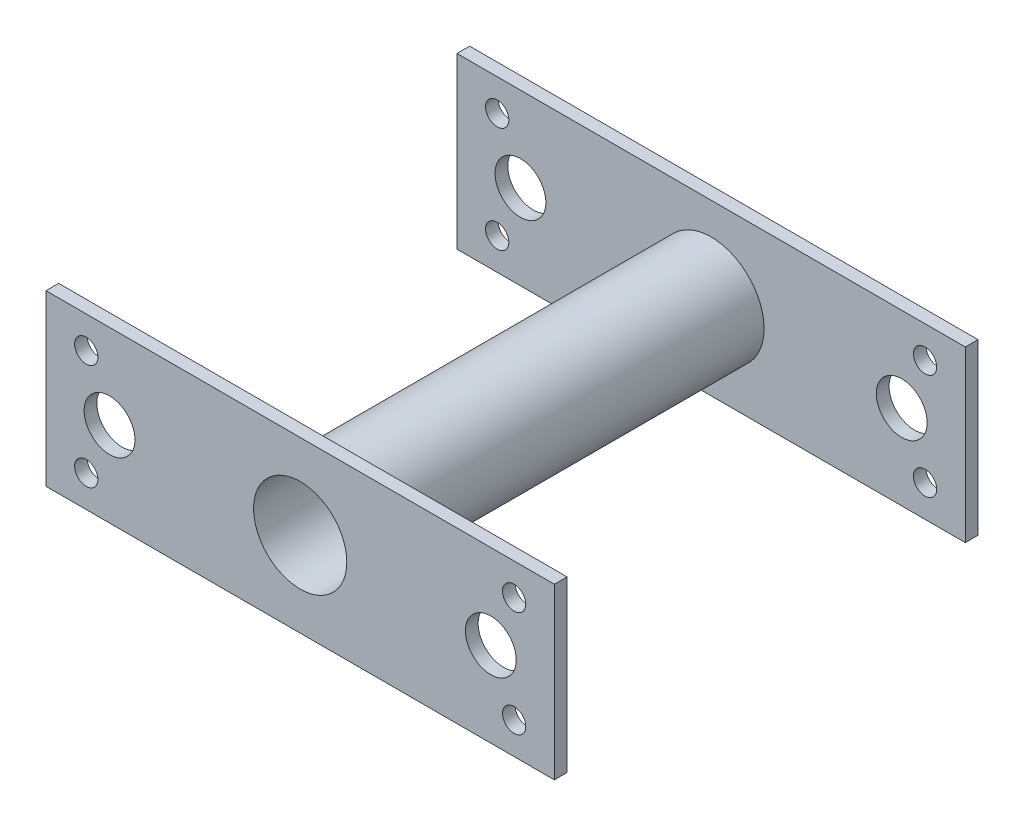
ISO-10303-21;
HEADER;
FILE_DESCRIPTION(('STEP AP214'),'2;1');
FILE_NAME('part.step','',(''),(''),'','','');
FILE_SCHEMA(('AUTOMOTIVE_DESIGN { 1 0 10303 214 1 1 1 1 }'));
ENDSEC;
DATA;
#1=APPLICATION_CONTEXT('core data for automotive mechanical design processes');
#2=APPLICATION_PROTOCOL_DEFINITION('international standard','automotive_design',2000,#1);
#3=PRODUCT_CONTEXT('',#1,'mechanical');
#4=PRODUCT('Part','Part','',(#3));
#5=PRODUCT_RELATED_PRODUCT_CATEGORY('part','',(#4));
#6=PRODUCT_DEFINITION_FORMATION('','',#4);
#7=PRODUCT_DEFINITION_CONTEXT('part definition',#1,'design');
#8=PRODUCT_DEFINITION('design','',#6,#7);
#9=PRODUCT_DEFINITION_SHAPE('','',#8);
#10=(LENGTH_UNIT() NAMED_UNIT(*) SI_UNIT(.MILLI.,.METRE.));
#11=(NAMED_UNIT(*) PLANE_ANGLE_UNIT() SI_UNIT($,.RADIAN.));
#12=(NAMED_UNIT(*) SI_UNIT($,.STERADIAN.) SOLID_ANGLE_UNIT());
#13=UNCERTAINTY_MEASURE_WITH_UNIT(LENGTH_MEASURE(1.E-05),#10,'distance_accuracy_value','');
#14=(GEOMETRIC_REPRESENTATION_CONTEXT(3) GLOBAL_UNCERTAINTY_ASSIGNED_CONTEXT((#13)) GLOBAL_UNIT_ASSIGNED_CONTEXT((#10,
#11,#12)) REPRESENTATION_CONTEXT('',''));
#15=CARTESIAN_POINT('',(0.,0.,0.));
#16=DIRECTION('',(0.,0.,1.));
#17=DIRECTION('',(1.,0.,0.));
#18=AXIS2_PLACEMENT_3D('',#15,#16,#17);
#19=CARTESIAN_POINT('',(-60.,20.,3.));
#20=DIRECTION('',(1.,0.,0.));
#21=DIRECTION('',(0.,1.,0.));
#22=AXIS2_PLACEMENT_3D('',#19,#20,#21);
#23=PLANE('',#22);
#24=DIRECTION('',(0.,-1.,0.));
#25=VECTOR('',#24,1.);
#26=CARTESIAN_POINT('',(-60.,20.,0.));
#27=LINE('',#26,#25);
#28=CARTESIAN_POINT('',(-60.,20.,0.));
#29=VERTEX_POINT('',#28);
#30=CARTESIAN_POINT('',(-60.,-20.,0.));
#31=VERTEX_POINT('',#30);
#32=EDGE_CURVE('E148',#29,#31,#27,.T.);
#33=ORIENTED_EDGE('',*,*,#32,.T.);
#34=DIRECTION('',(0.,0.,-1.));
#35=VECTOR('',#34,1.);
#36=CARTESIAN_POINT('',(-60.,-20.,3.));
#37=LINE('',#36,#35);
#38=CARTESIAN_POINT('',(-60.,-20.,3.));
#39=VERTEX_POINT('',#38);
#40=EDGE_CURVE('E52',#39,#31,#37,.T.);
#41=ORIENTED_EDGE('',*,*,#40,.F.);
#42=DIRECTION('',(0.,-1.,0.));
#43=VECTOR('',#42,1.);
#44=CARTESIAN_POINT('',(-60.,20.,3.));
#45=LINE('',#44,#43);
#46=CARTESIAN_POINT('',(-60.,20.,3.));
#47=VERTEX_POINT('',#46);
#48=EDGE_CURVE('E154',#47,#39,#45,.T.);
#49=ORIENTED_EDGE('',*,*,#48,.F.);
#50=DIRECTION('',(0.,0.,-1.));
#51=VECTOR('',#50,1.);
#52=CARTESIAN_POINT('',(-60.,20.,3.));
#53=LINE('',#52,#51);
#54=EDGE_CURVE('E160',#47,#29,#53,.T.);
#55=ORIENTED_EDGE('',*,*,#54,.T.);
#56=EDGE_LOOP('',(#33,#41,#49,#55));
#57=FACE_BOUND('',#56,.T.);
#58=ADVANCED_FACE('F43',(#57),#23,.F.);
#59=CARTESIAN_POINT('',(-60.,-20.,3.));
#60=DIRECTION('',(0.,1.,0.));
#61=DIRECTION('',(0.,0.,1.));
#62=AXIS2_PLACEMENT_3D('',#59,#60,#61);
#63=PLANE('',#62);
#64=DIRECTION('',(1.,0.,0.));
#65=VECTOR('',#64,1.);
#66=CARTESIAN_POINT('',(-60.,-20.,0.));
#67=LINE('',#66,#65);
#68=CARTESIAN_POINT('',(60.,-20.,0.));
#69=VERTEX_POINT('',#68);
#70=EDGE_CURVE('E163',#31,#69,#67,.T.);
#71=ORIENTED_EDGE('',*,*,#70,.T.);
#72=DIRECTION('',(0.,0.,-1.));
#73=VECTOR('',#72,1.);
#74=CARTESIAN_POINT('',(60.,-20.,3.));
#75=LINE('',#74,#73);
#76=CARTESIAN_POINT('',(60.,-20.,3.));
#77=VERTEX_POINT('',#76);
#78=EDGE_CURVE('E170',#77,#69,#75,.T.);
#79=ORIENTED_EDGE('',*,*,#78,.F.);
#80=DIRECTION('',(1.,0.,0.));
#81=VECTOR('',#80,1.);
#82=CARTESIAN_POINT('',(-60.,-20.,3.));
#83=LINE('',#82,#81);
#84=EDGE_CURVE('E93',#39,#77,#83,.T.);
#85=ORIENTED_EDGE('',*,*,#84,.F.);
#86=ORIENTED_EDGE('',*,*,#40,.T.);
#87=EDGE_LOOP('',(#71,#79,#85,#86));
#88=FACE_BOUND('',#87,.T.);
#89=ADVANCED_FACE('F279',(#88),#63,.F.);
#90=CARTESIAN_POINT('',(60.,20.,3.));
#91=DIRECTION('',(-1.,0.,0.));
#92=DIRECTION('',(0.,-1.,0.));
#93=AXIS2_PLACEMENT_3D('',#90,#91,#92);
#94=PLANE('',#93);
#95=DIRECTION('',(0.,1.,0.));
#96=VECTOR('',#95,1.);
#97=CARTESIAN_POINT('',(60.,20.,0.));
#98=LINE('',#97,#96);
#99=CARTESIAN_POINT('',(60.,20.,0.));
#100=VERTEX_POINT('',#99);
#101=EDGE_CURVE('E79',#69,#100,#98,.T.);
#102=ORIENTED_EDGE('',*,*,#101,.T.);
#103=DIRECTION('',(0.,0.,-1.));
#104=VECTOR('',#103,1.);
#105=CARTESIAN_POINT('',(60.,20.,3.));
#106=LINE('',#105,#104);
#107=CARTESIAN_POINT('',(60.,20.,3.));
#108=VERTEX_POINT('',#107);
#109=EDGE_CURVE('E168',#108,#100,#106,.T.);
#110=ORIENTED_EDGE('',*,*,#109,.F.);
#111=DIRECTION('',(0.,1.,0.));
#112=VECTOR('',#111,1.);
#113=CARTESIAN_POINT('',(60.,20.,3.));
#114=LINE('',#113,#112);
#115=EDGE_CURVE('E157',#77,#108,#114,.T.);
#116=ORIENTED_EDGE('',*,*,#115,.F.);
#117=ORIENTED_EDGE('',*,*,#78,.T.);
#118=EDGE_LOOP('',(#102,#110,#116,#117));
#119=FACE_BOUND('',#118,.T.);
#120=ADVANCED_FACE('F284',(#119),#94,.F.);
#121=CARTESIAN_POINT('',(-60.,20.,3.));
#122=DIRECTION('',(0.,-1.,0.));
#123=DIRECTION('',(0.,0.,-1.));
#124=AXIS2_PLACEMENT_3D('',#121,#122,#123);
#125=PLANE('',#124);
#126=DIRECTION('',(-1.,0.,0.));
#127=VECTOR('',#126,1.);
#128=CARTESIAN_POINT('',(-60.,20.,0.));
#129=LINE('',#128,#127);
#130=EDGE_CURVE('E85',#100,#29,#129,.T.);
#131=ORIENTED_EDGE('',*,*,#130,.T.);
#132=ORIENTED_EDGE('',*,*,#54,.F.);
#133=DIRECTION('',(-1.,0.,0.));
#134=VECTOR('',#133,1.);
#135=CARTESIAN_POINT('',(-60.,20.,3.));
#136=LINE('',#135,#134);
#137=EDGE_CURVE('E61',#108,#47,#136,.T.);
#138=ORIENTED_EDGE('',*,*,#137,.F.);
#139=ORIENTED_EDGE('',*,*,#109,.T.);
#140=EDGE_LOOP('',(#131,#132,#138,#139));
#141=FACE_BOUND('',#140,.T.);
#142=ADVANCED_FACE('F293',(#141),#125,.F.);
#143=CARTESIAN_POINT('',(0.,0.,3.));
#144=DIRECTION('',(0.,0.,1.));
#145=DIRECTION('',(1.,0.,0.));
#146=AXIS2_PLACEMENT_3D('',#143,#144,#145);
#147=PLANE('',#146);
#148=CARTESIAN_POINT('',(45.,0.,3.));
#149=DIRECTION('',(0.,0.,1.));
#150=DIRECTION('',(1.,0.,0.));
#151=AXIS2_PLACEMENT_3D('',#148,#149,#150);
#152=CIRCLE('',#151,6.);
#153=CARTESIAN_POINT('',(51.,0.,3.));
#154=VERTEX_POINT('',#153);
#155=EDGE_CURVE('E215',#154,#154,#152,.T.);
#156=ORIENTED_EDGE('',*,*,#155,.F.);
#157=EDGE_LOOP('',(#156));
#158=FACE_BOUND('',#157,.T.);
#159=CARTESIAN_POINT('',(-45.,0.,3.));
#160=DIRECTION('',(0.,0.,1.));
#161=DIRECTION('',(1.,0.,0.));
#162=AXIS2_PLACEMENT_3D('',#159,#160,#161);
#163=CIRCLE('',#162,6.);
#164=CARTESIAN_POINT('',(-39.,0.,3.));
#165=VERTEX_POINT('',#164);
#166=EDGE_CURVE('E195',#165,#165,#163,.T.);
#167=ORIENTED_EDGE('',*,*,#166,.F.);
#168=EDGE_LOOP('',(#167));
#169=FACE_BOUND('',#168,.T.);
#170=CARTESIAN_POINT('',(-50.5,-12.5,3.));
#171=DIRECTION('',(0.,0.,1.));
#172=DIRECTION('',(1.,0.,0.));
#173=AXIS2_PLACEMENT_3D('',#170,#171,#172);
#174=CIRCLE('',#173,2.75);
#175=CARTESIAN_POINT('',(-47.75,-12.5,3.));
#176=VERTEX_POINT('',#175);
#177=EDGE_CURVE('E192',#176,#176,#174,.T.);
#178=ORIENTED_EDGE('',*,*,#177,.F.);
#179=EDGE_LOOP('',(#178));
#180=FACE_BOUND('',#179,.T.);
#181=CARTESIAN_POINT('',(50.5,12.5,3.));
#182=DIRECTION('',(0.,0.,1.));
#183=DIRECTION('',(1.,0.,0.));
#184=AXIS2_PLACEMENT_3D('',#181,#182,#183);
#185=CIRCLE('',#184,2.75);
#186=CARTESIAN_POINT('',(53.25,12.5,3.));
#187=VERTEX_POINT('',#186);
#188=EDGE_CURVE('E189',#187,#187,#185,.T.);
#189=ORIENTED_EDGE('',*,*,#188,.F.);
#190=EDGE_LOOP('',(#189));
#191=FACE_BOUND('',#190,.T.);
#192=CARTESIAN_POINT('',(50.5,-12.5,3.));
#193=DIRECTION('',(0.,0.,1.));
#194=DIRECTION('',(1.,0.,0.));
#195=AXIS2_PLACEMENT_3D('',#192,#193,#194);
#196=CIRCLE('',#195,2.75);
#197=CARTESIAN_POINT('',(53.25,-12.5,3.));
#198=VERTEX_POINT('',#197);
#199=EDGE_CURVE('E185',#198,#198,#196,.T.);
#200=ORIENTED_EDGE('',*,*,#199,.F.);
#201=EDGE_LOOP('',(#200));
#202=FACE_BOUND('',#201,.T.);
#203=CARTESIAN_POINT('',(-50.5,12.5,3.));
#204=DIRECTION('',(0.,0.,1.));
#205=DIRECTION('',(1.,0.,0.));
#206=AXIS2_PLACEMENT_3D('',#203,#204,#205);
#207=CIRCLE('',#206,2.75);
#208=CARTESIAN_POINT('',(-47.75,12.5,3.));
#209=VERTEX_POINT('',#208);
#210=EDGE_CURVE('E180',#209,#209,#207,.T.);
#211=ORIENTED_EDGE('',*,*,#210,.F.);
#212=EDGE_LOOP('',(#211));
#213=FACE_BOUND('',#212,.T.);
#214=CARTESIAN_POINT('',(0.,0.,3.));
#215=DIRECTION('',(0.,0.,1.));
#216=DIRECTION('',(1.,0.,0.));
#217=AXIS2_PLACEMENT_3D('',#214,#215,#216);
#218=CIRCLE('',#217,12.5);
#219=CARTESIAN_POINT('',(12.5,0.,3.));
#220=VERTEX_POINT('',#219);
#221=EDGE_CURVE('E11',#220,#220,#218,.T.);
#222=ORIENTED_EDGE('',*,*,#221,.F.);
#223=EDGE_LOOP('',(#222));
#224=FACE_BOUND('',#223,.T.);
#225=ORIENTED_EDGE('',*,*,#48,.T.);
#226=ORIENTED_EDGE('',*,*,#84,.T.);
#227=ORIENTED_EDGE('',*,*,#115,.T.);
#228=ORIENTED_EDGE('',*,*,#137,.T.);
#229=EDGE_LOOP('',(#225,#226,#227,#228));
#230=FACE_BOUND('',#229,.T.);
#231=ADVANCED_FACE('F291',(#158,#169,#180,#191,#202,#213,#224,#230),#147,.T.);
#232=CARTESIAN_POINT('',(0.,0.,0.));
#233=DIRECTION('',(0.,0.,1.));
#234=DIRECTION('',(1.,0.,0.));
#235=AXIS2_PLACEMENT_3D('',#232,#233,#234);
#236=PLANE('',#235);
#237=CARTESIAN_POINT('',(45.,0.,0.));
#238=DIRECTION('',(0.,0.,1.));
#239=DIRECTION('',(1.,0.,0.));
#240=AXIS2_PLACEMENT_3D('',#237,#238,#239);
#241=CIRCLE('',#240,6.);
#242=CARTESIAN_POINT('',(51.,0.,0.));
#243=VERTEX_POINT('',#242);
#244=EDGE_CURVE('E196',#243,#243,#241,.T.);
#245=ORIENTED_EDGE('',*,*,#244,.T.);
#246=EDGE_LOOP('',(#245));
#247=FACE_BOUND('',#246,.T.);
#248=CARTESIAN_POINT('',(-45.,0.,0.));
#249=DIRECTION('',(0.,0.,1.));
#250=DIRECTION('',(-1.,0.,0.));
#251=AXIS2_PLACEMENT_3D('',#248,#249,#250);
#252=CIRCLE('',#251,6.);
#253=CARTESIAN_POINT('',(-51.,0.,0.));
#254=VERTEX_POINT('',#253);
#255=EDGE_CURVE('E207',#254,#254,#252,.T.);
#256=ORIENTED_EDGE('',*,*,#255,.T.);
#257=EDGE_LOOP('',(#256));
#258=FACE_BOUND('',#257,.T.);
#259=CARTESIAN_POINT('',(-50.5,-12.5,0.));
#260=DIRECTION('',(0.,0.,1.));
#261=DIRECTION('',(1.,0.,0.));
#262=AXIS2_PLACEMENT_3D('',#259,#260,#261);
#263=CIRCLE('',#262,2.75);
#264=CARTESIAN_POINT('',(-47.75,-12.5,0.));
#265=VERTEX_POINT('',#264);
#266=EDGE_CURVE('E225',#265,#265,#263,.T.);
#267=ORIENTED_EDGE('',*,*,#266,.T.);
#268=EDGE_LOOP('',(#267));
#269=FACE_BOUND('',#268,.T.);
#270=CARTESIAN_POINT('',(50.5,12.5,0.));
#271=DIRECTION('',(0.,0.,1.));
#272=DIRECTION('',(1.,0.,0.));
#273=AXIS2_PLACEMENT_3D('',#270,#271,#272);
#274=CIRCLE('',#273,2.75);
#275=CARTESIAN_POINT('',(53.25,12.5,0.));
#276=VERTEX_POINT('',#275);
#277=EDGE_CURVE('E232',#276,#276,#274,.T.);
#278=ORIENTED_EDGE('',*,*,#277,.T.);
#279=EDGE_LOOP('',(#278));
#280=FACE_BOUND('',#279,.T.);
#281=CARTESIAN_POINT('',(50.5,-12.5,0.));
#282=DIRECTION('',(0.,0.,1.));
#283=DIRECTION('',(1.,0.,0.));
#284=AXIS2_PLACEMENT_3D('',#281,#282,#283);
#285=CIRCLE('',#284,2.75);
#286=CARTESIAN_POINT('',(53.25,-12.5,0.));
#287=VERTEX_POINT('',#286);
#288=EDGE_CURVE('E219',#287,#287,#285,.T.);
#289=ORIENTED_EDGE('',*,*,#288,.T.);
#290=EDGE_LOOP('',(#289));
#291=FACE_BOUND('',#290,.T.);
#292=CARTESIAN_POINT('',(-50.5,12.5,0.));
#293=DIRECTION('',(0.,0.,1.));
#294=DIRECTION('',(1.,0.,0.));
#295=AXIS2_PLACEMENT_3D('',#292,#293,#294);
#296=CIRCLE('',#295,2.75);
#297=CARTESIAN_POINT('',(-47.75,12.5,0.));
#298=VERTEX_POINT('',#297);
#299=EDGE_CURVE('E181',#298,#298,#296,.T.);
#300=ORIENTED_EDGE('',*,*,#299,.T.);
#301=EDGE_LOOP('',(#300));
#302=FACE_BOUND('',#301,.T.);
#303=CARTESIAN_POINT('',(0.,0.,0.));
#304=DIRECTION('',(0.,0.,1.));
#305=DIRECTION('',(1.,0.,0.));
#306=AXIS2_PLACEMENT_3D('',#303,#304,#305);
#307=CIRCLE('',#306,11.);
#308=CARTESIAN_POINT('',(11.,0.,0.));
#309=VERTEX_POINT('',#308);
#310=EDGE_CURVE('E176',#309,#309,#307,.T.);
#311=ORIENTED_EDGE('',*,*,#310,.T.);
#312=EDGE_LOOP('',(#311));
#313=FACE_BOUND('',#312,.T.);
#314=ORIENTED_EDGE('',*,*,#32,.F.);
#315=ORIENTED_EDGE('',*,*,#130,.F.);
#316=ORIENTED_EDGE('',*,*,#101,.F.);
#317=ORIENTED_EDGE('',*,*,#70,.F.);
#318=EDGE_LOOP('',(#314,#315,#316,#317));
#319=FACE_BOUND('',#318,.T.);
#320=ADVANCED_FACE('F289',(#247,#258,#269,#280,#291,#302,#313,#319),#236,.F.);
#321=CARTESIAN_POINT('',(0.,0.,97.));
#322=DIRECTION('',(0.,0.,-1.));
#323=DIRECTION('',(-1.,0.,0.));
#324=AXIS2_PLACEMENT_3D('',#321,#322,#323);
#325=CYLINDRICAL_SURFACE('',#324,12.5);
#326=CARTESIAN_POINT('',(0.,0.,97.));
#327=DIRECTION('',(0.,0.,1.));
#328=DIRECTION('',(1.,0.,0.));
#329=AXIS2_PLACEMENT_3D('',#326,#327,#328);
#330=CIRCLE('',#329,12.5);
#331=CARTESIAN_POINT('',(12.5,0.,97.));
#332=VERTEX_POINT('',#331);
#333=EDGE_CURVE('E145',#332,#332,#330,.T.);
#334=ORIENTED_EDGE('',*,*,#333,.F.);
#335=EDGE_LOOP('',(#334));
#336=FACE_BOUND('',#335,.T.);
#337=ORIENTED_EDGE('',*,*,#221,.T.);
#338=EDGE_LOOP('',(#337));
#339=FACE_BOUND('',#338,.T.);
#340=ADVANCED_FACE('F300',(#336,#339),#325,.T.);
#341=CARTESIAN_POINT('',(-60.,20.,100.));
#342=DIRECTION('',(1.,0.,0.));
#343=DIRECTION('',(0.,0.,-1.));
#344=AXIS2_PLACEMENT_3D('',#341,#342,#343);
#345=PLANE('',#344);
#346=DIRECTION('',(0.,-1.,0.));
#347=VECTOR('',#346,1.);
#348=CARTESIAN_POINT('',(-60.,20.,97.));
#349=LINE('',#348,#347);
#350=CARTESIAN_POINT('',(-60.,20.,97.));
#351=VERTEX_POINT('',#350);
#352=CARTESIAN_POINT('',(-60.,-20.,97.));
#353=VERTEX_POINT('',#352);
#354=EDGE_CURVE('E144',#351,#353,#349,.T.);
#355=ORIENTED_EDGE('',*,*,#354,.T.);
#356=DIRECTION('',(0.,0.,-1.));
#357=VECTOR('',#356,1.);
#358=CARTESIAN_POINT('',(-60.,-20.,100.));
#359=LINE('',#358,#357);
#360=CARTESIAN_POINT('',(-60.,-20.,100.));
#361=VERTEX_POINT('',#360);
#362=EDGE_CURVE('E124',#361,#353,#359,.T.);
#363=ORIENTED_EDGE('',*,*,#362,.F.);
#364=DIRECTION('',(0.,-1.,0.));
#365=VECTOR('',#364,1.);
#366=CARTESIAN_POINT('',(-60.,20.,100.));
#367=LINE('',#366,#365);
#368=CARTESIAN_POINT('',(-60.,20.,100.));
#369=VERTEX_POINT('',#368);
#370=EDGE_CURVE('E131',#369,#361,#367,.T.);
#371=ORIENTED_EDGE('',*,*,#370,.F.);
#372=DIRECTION('',(0.,0.,-1.));
#373=VECTOR('',#372,1.);
#374=CARTESIAN_POINT('',(-60.,20.,100.));
#375=LINE('',#374,#373);
#376=EDGE_CURVE('E253',#369,#351,#375,.T.);
#377=ORIENTED_EDGE('',*,*,#376,.T.);
#378=EDGE_LOOP('',(#355,#363,#371,#377));
#379=FACE_BOUND('',#378,.T.);
#380=ADVANCED_FACE('F142',(#379),#345,.F.);
#381=CARTESIAN_POINT('',(-60.,-20.,100.));
#382=DIRECTION('',(0.,1.,0.));
#383=DIRECTION('',(0.,0.,1.));
#384=AXIS2_PLACEMENT_3D('',#381,#382,#383);
#385=PLANE('',#384);
#386=DIRECTION('',(1.,0.,0.));
#387=VECTOR('',#386,1.);
#388=CARTESIAN_POINT('',(-60.,-20.,97.));
#389=LINE('',#388,#387);
#390=CARTESIAN_POINT('',(60.,-20.,97.));
#391=VERTEX_POINT('',#390);
#392=EDGE_CURVE('E255',#353,#391,#389,.T.);
#393=ORIENTED_EDGE('',*,*,#392,.T.);
#394=DIRECTION('',(0.,0.,-1.));
#395=VECTOR('',#394,1.);
#396=CARTESIAN_POINT('',(60.,-20.,100.));
#397=LINE('',#396,#395);
#398=CARTESIAN_POINT('',(60.,-20.,100.));
#399=VERTEX_POINT('',#398);
#400=EDGE_CURVE('E127',#399,#391,#397,.T.);
#401=ORIENTED_EDGE('',*,*,#400,.F.);
#402=DIRECTION('',(1.,0.,0.));
#403=VECTOR('',#402,1.);
#404=CARTESIAN_POINT('',(-60.,-20.,100.));
#405=LINE('',#404,#403);
#406=EDGE_CURVE('E120',#361,#399,#405,.T.);
#407=ORIENTED_EDGE('',*,*,#406,.F.);
#408=ORIENTED_EDGE('',*,*,#362,.T.);
#409=EDGE_LOOP('',(#393,#401,#407,#408));
#410=FACE_BOUND('',#409,.T.);
#411=ADVANCED_FACE('F122',(#410),#385,.F.);
#412=CARTESIAN_POINT('',(60.,20.,100.));
#413=DIRECTION('',(-1.,0.,0.));
#414=DIRECTION('',(0.,0.,1.));
#415=AXIS2_PLACEMENT_3D('',#412,#413,#414);
#416=PLANE('',#415);
#417=DIRECTION('',(0.,1.,0.));
#418=VECTOR('',#417,1.);
#419=CARTESIAN_POINT('',(60.,20.,97.));
#420=LINE('',#419,#418);
#421=CARTESIAN_POINT('',(60.,20.,97.));
#422=VERTEX_POINT('',#421);
#423=EDGE_CURVE('E257',#391,#422,#420,.T.);
#424=ORIENTED_EDGE('',*,*,#423,.T.);
#425=DIRECTION('',(0.,0.,-1.));
#426=VECTOR('',#425,1.);
#427=CARTESIAN_POINT('',(60.,20.,100.));
#428=LINE('',#427,#426);
#429=CARTESIAN_POINT('',(60.,20.,100.));
#430=VERTEX_POINT('',#429);
#431=EDGE_CURVE('E150',#430,#422,#428,.T.);
#432=ORIENTED_EDGE('',*,*,#431,.F.);
#433=DIRECTION('',(0.,1.,0.));
#434=VECTOR('',#433,1.);
#435=CARTESIAN_POINT('',(60.,20.,100.));
#436=LINE('',#435,#434);
#437=EDGE_CURVE('E130',#399,#430,#436,.T.);
#438=ORIENTED_EDGE('',*,*,#437,.F.);
#439=ORIENTED_EDGE('',*,*,#400,.T.);
#440=EDGE_LOOP('',(#424,#432,#438,#439));
#441=FACE_BOUND('',#440,.T.);
#442=ADVANCED_FACE('F269',(#441),#416,.F.);
#443=CARTESIAN_POINT('',(-60.,20.,100.));
#444=DIRECTION('',(0.,-1.,0.));
#445=DIRECTION('',(0.,0.,-1.));
#446=AXIS2_PLACEMENT_3D('',#443,#444,#445);
#447=PLANE('',#446);
#448=DIRECTION('',(-1.,0.,0.));
#449=VECTOR('',#448,1.);
#450=CARTESIAN_POINT('',(-60.,20.,97.));
#451=LINE('',#450,#449);
#452=EDGE_CURVE('E140',#422,#351,#451,.T.);
#453=ORIENTED_EDGE('',*,*,#452,.T.);
#454=ORIENTED_EDGE('',*,*,#376,.F.);
#455=DIRECTION('',(-1.,0.,0.));
#456=VECTOR('',#455,1.);
#457=CARTESIAN_POINT('',(-60.,20.,100.));
#458=LINE('',#457,#456);
#459=EDGE_CURVE('E136',#430,#369,#458,.T.);
#460=ORIENTED_EDGE('',*,*,#459,.F.);
#461=ORIENTED_EDGE('',*,*,#431,.T.);
#462=EDGE_LOOP('',(#453,#454,#460,#461));
#463=FACE_BOUND('',#462,.T.);
#464=ADVANCED_FACE('F264',(#463),#447,.F.);
#465=CARTESIAN_POINT('',(0.,0.,100.));
#466=DIRECTION('',(0.,0.,1.));
#467=DIRECTION('',(1.,0.,0.));
#468=AXIS2_PLACEMENT_3D('',#465,#466,#467);
#469=PLANE('',#468);
#470=CARTESIAN_POINT('',(45.,0.,100.));
#471=DIRECTION('',(0.,0.,1.));
#472=DIRECTION('',(1.,0.,0.));
#473=AXIS2_PLACEMENT_3D('',#470,#471,#472);
#474=CIRCLE('',#473,6.);
#475=CARTESIAN_POINT('',(51.,0.,100.));
#476=VERTEX_POINT('',#475);
#477=EDGE_CURVE('E202',#476,#476,#474,.T.);
#478=ORIENTED_EDGE('',*,*,#477,.F.);
#479=EDGE_LOOP('',(#478));
#480=FACE_BOUND('',#479,.T.);
#481=CARTESIAN_POINT('',(-45.,0.,100.));
#482=DIRECTION('',(0.,0.,1.));
#483=DIRECTION('',(-1.,0.,0.));
#484=AXIS2_PLACEMENT_3D('',#481,#482,#483);
#485=CIRCLE('',#484,6.);
#486=CARTESIAN_POINT('',(-51.,0.,100.));
#487=VERTEX_POINT('',#486);
#488=EDGE_CURVE('E212',#487,#487,#485,.T.);
#489=ORIENTED_EDGE('',*,*,#488,.F.);
#490=EDGE_LOOP('',(#489));
#491=FACE_BOUND('',#490,.T.);
#492=CARTESIAN_POINT('',(-50.5,-12.5,100.));
#493=DIRECTION('',(0.,0.,1.));
#494=DIRECTION('',(1.,0.,0.));
#495=AXIS2_PLACEMENT_3D('',#492,#493,#494);
#496=CIRCLE('',#495,2.75);
#497=CARTESIAN_POINT('',(-47.75,-12.5,100.));
#498=VERTEX_POINT('',#497);
#499=EDGE_CURVE('E229',#498,#498,#496,.T.);
#500=ORIENTED_EDGE('',*,*,#499,.F.);
#501=EDGE_LOOP('',(#500));
#502=FACE_BOUND('',#501,.T.);
#503=CARTESIAN_POINT('',(50.5,12.5,100.));
#504=DIRECTION('',(0.,0.,1.));
#505=DIRECTION('',(1.,0.,0.));
#506=AXIS2_PLACEMENT_3D('',#503,#504,#505);
#507=CIRCLE('',#506,2.75);
#508=CARTESIAN_POINT('',(53.25,12.5,100.));
#509=VERTEX_POINT('',#508);
#510=EDGE_CURVE('E222',#509,#509,#507,.T.);
#511=ORIENTED_EDGE('',*,*,#510,.F.);
#512=EDGE_LOOP('',(#511));
#513=FACE_BOUND('',#512,.T.);
#514=CARTESIAN_POINT('',(50.5,-12.5,100.));
#515=DIRECTION('',(0.,0.,1.));
#516=DIRECTION('',(1.,0.,0.));
#517=AXIS2_PLACEMENT_3D('',#514,#515,#516);
#518=CIRCLE('',#517,2.75);
#519=CARTESIAN_POINT('',(53.25,-12.5,100.));
#520=VERTEX_POINT('',#519);
#521=EDGE_CURVE('E218',#520,#520,#518,.T.);
#522=ORIENTED_EDGE('',*,*,#521,.F.);
#523=EDGE_LOOP('',(#522));
#524=FACE_BOUND('',#523,.T.);
#525=CARTESIAN_POINT('',(-50.5,12.5,100.));
#526=DIRECTION('',(0.,0.,1.));
#527=DIRECTION('',(1.,0.,0.));
#528=AXIS2_PLACEMENT_3D('',#525,#526,#527);
#529=CIRCLE('',#528,2.75);
#530=CARTESIAN_POINT('',(-47.75,12.5,100.));
#531=VERTEX_POINT('',#530);
#532=EDGE_CURVE('E228',#531,#531,#529,.T.);
#533=ORIENTED_EDGE('',*,*,#532,.F.);
#534=EDGE_LOOP('',(#533));
#535=FACE_BOUND('',#534,.T.);
#536=CARTESIAN_POINT('',(0.,0.,100.));
#537=DIRECTION('',(0.,0.,1.));
#538=DIRECTION('',(1.,0.,0.));
#539=AXIS2_PLACEMENT_3D('',#536,#537,#538);
#540=CIRCLE('',#539,11.);
#541=CARTESIAN_POINT('',(11.,0.,100.));
#542=VERTEX_POINT('',#541);
#543=EDGE_CURVE('E173',#542,#542,#540,.T.);
#544=ORIENTED_EDGE('',*,*,#543,.F.);
#545=EDGE_LOOP('',(#544));
#546=FACE_BOUND('',#545,.T.);
#547=ORIENTED_EDGE('',*,*,#370,.T.);
#548=ORIENTED_EDGE('',*,*,#406,.T.);
#549=ORIENTED_EDGE('',*,*,#437,.T.);
#550=ORIENTED_EDGE('',*,*,#459,.T.);
#551=EDGE_LOOP('',(#547,#548,#549,#550));
#552=FACE_BOUND('',#551,.T.);
#553=ADVANCED_FACE('F134',(#480,#491,#502,#513,#524,#535,#546,#552),#469,.T.);
#554=CARTESIAN_POINT('',(0.,0.,97.));
#555=DIRECTION('',(0.,0.,1.));
#556=DIRECTION('',(1.,0.,0.));
#557=AXIS2_PLACEMENT_3D('',#554,#555,#556);
#558=PLANE('',#557);
#559=CARTESIAN_POINT('',(45.,0.,97.));
#560=DIRECTION('',(0.,0.,1.));
#561=DIRECTION('',(1.,0.,0.));
#562=AXIS2_PLACEMENT_3D('',#559,#560,#561);
#563=CIRCLE('',#562,6.);
#564=CARTESIAN_POINT('',(51.,0.,97.));
#565=VERTEX_POINT('',#564);
#566=EDGE_CURVE('E46',#565,#565,#563,.T.);
#567=ORIENTED_EDGE('',*,*,#566,.T.);
#568=EDGE_LOOP('',(#567));
#569=FACE_BOUND('',#568,.T.);
#570=CARTESIAN_POINT('',(-45.,0.,97.));
#571=DIRECTION('',(0.,0.,1.));
#572=DIRECTION('',(1.,0.,0.));
#573=AXIS2_PLACEMENT_3D('',#570,#571,#572);
#574=CIRCLE('',#573,6.);
#575=CARTESIAN_POINT('',(-39.,0.,97.));
#576=VERTEX_POINT('',#575);
#577=EDGE_CURVE('E193',#576,#576,#574,.T.);
#578=ORIENTED_EDGE('',*,*,#577,.T.);
#579=EDGE_LOOP('',(#578));
#580=FACE_BOUND('',#579,.T.);
#581=CARTESIAN_POINT('',(-50.5,-12.5,97.));
#582=DIRECTION('',(0.,0.,1.));
#583=DIRECTION('',(1.,0.,0.));
#584=AXIS2_PLACEMENT_3D('',#581,#582,#583);
#585=CIRCLE('',#584,2.75);
#586=CARTESIAN_POINT('',(-47.75,-12.5,97.));
#587=VERTEX_POINT('',#586);
#588=EDGE_CURVE('E190',#587,#587,#585,.T.);
#589=ORIENTED_EDGE('',*,*,#588,.T.);
#590=EDGE_LOOP('',(#589));
#591=FACE_BOUND('',#590,.T.);
#592=CARTESIAN_POINT('',(50.5,12.5,97.));
#593=DIRECTION('',(0.,0.,1.));
#594=DIRECTION('',(1.,0.,0.));
#595=AXIS2_PLACEMENT_3D('',#592,#593,#594);
#596=CIRCLE('',#595,2.75);
#597=CARTESIAN_POINT('',(53.25,12.5,97.));
#598=VERTEX_POINT('',#597);
#599=EDGE_CURVE('E186',#598,#598,#596,.T.);
#600=ORIENTED_EDGE('',*,*,#599,.T.);
#601=EDGE_LOOP('',(#600));
#602=FACE_BOUND('',#601,.T.);
#603=CARTESIAN_POINT('',(50.5,-12.5,97.));
#604=DIRECTION('',(0.,0.,1.));
#605=DIRECTION('',(1.,0.,0.));
#606=AXIS2_PLACEMENT_3D('',#603,#604,#605);
#607=CIRCLE('',#606,2.75);
#608=CARTESIAN_POINT('',(53.25,-12.5,97.));
#609=VERTEX_POINT('',#608);
#610=EDGE_CURVE('E182',#609,#609,#607,.T.);
#611=ORIENTED_EDGE('',*,*,#610,.T.);
#612=EDGE_LOOP('',(#611));
#613=FACE_BOUND('',#612,.T.);
#614=CARTESIAN_POINT('',(-50.5,12.5,97.));
#615=DIRECTION('',(0.,0.,1.));
#616=DIRECTION('',(1.,0.,0.));
#617=AXIS2_PLACEMENT_3D('',#614,#615,#616);
#618=CIRCLE('',#617,2.75);
#619=CARTESIAN_POINT('',(-47.75,12.5,97.));
#620=VERTEX_POINT('',#619);
#621=EDGE_CURVE('E177',#620,#620,#618,.T.);
#622=ORIENTED_EDGE('',*,*,#621,.T.);
#623=EDGE_LOOP('',(#622));
#624=FACE_BOUND('',#623,.T.);
#625=ORIENTED_EDGE('',*,*,#333,.T.);
#626=EDGE_LOOP('',(#625));
#627=FACE_BOUND('',#626,.T.);
#628=ORIENTED_EDGE('',*,*,#354,.F.);
#629=ORIENTED_EDGE('',*,*,#452,.F.);
#630=ORIENTED_EDGE('',*,*,#423,.F.);
#631=ORIENTED_EDGE('',*,*,#392,.F.);
#632=EDGE_LOOP('',(#628,#629,#630,#631));
#633=FACE_BOUND('',#632,.T.);
#634=ADVANCED_FACE('F268',(#569,#580,#591,#602,#613,#624,#627,#633),#558,.F.);
#635=CARTESIAN_POINT('',(0.,0.,0.));
#636=DIRECTION('',(0.,0.,1.));
#637=DIRECTION('',(1.,0.,0.));
#638=AXIS2_PLACEMENT_3D('',#635,#636,#637);
#639=CYLINDRICAL_SURFACE('',#638,11.);
#640=ORIENTED_EDGE('',*,*,#543,.T.);
#641=EDGE_LOOP('',(#640));
#642=FACE_BOUND('',#641,.T.);
#643=ORIENTED_EDGE('',*,*,#310,.F.);
#644=EDGE_LOOP('',(#643));
#645=FACE_BOUND('',#644,.T.);
#646=ADVANCED_FACE('F355',(#642,#645),#639,.F.);
#647=CARTESIAN_POINT('',(-50.5,12.5,0.));
#648=DIRECTION('',(0.,0.,1.));
#649=DIRECTION('',(1.,0.,0.));
#650=AXIS2_PLACEMENT_3D('',#647,#648,#649);
#651=CYLINDRICAL_SURFACE('',#650,2.75);
#652=ORIENTED_EDGE('',*,*,#532,.T.);
#653=EDGE_LOOP('',(#652));
#654=FACE_BOUND('',#653,.T.);
#655=ORIENTED_EDGE('',*,*,#621,.F.);
#656=EDGE_LOOP('',(#655));
#657=FACE_BOUND('',#656,.T.);
#658=ADVANCED_FACE('F363',(#654,#657),#651,.F.);
#659=CARTESIAN_POINT('',(50.5,-12.5,0.));
#660=DIRECTION('',(0.,0.,1.));
#661=DIRECTION('',(1.,0.,0.));
#662=AXIS2_PLACEMENT_3D('',#659,#660,#661);
#663=CYLINDRICAL_SURFACE('',#662,2.75);
#664=ORIENTED_EDGE('',*,*,#521,.T.);
#665=EDGE_LOOP('',(#664));
#666=FACE_BOUND('',#665,.T.);
#667=ORIENTED_EDGE('',*,*,#610,.F.);
#668=EDGE_LOOP('',(#667));
#669=FACE_BOUND('',#668,.T.);
#670=ADVANCED_FACE('F371',(#666,#669),#663,.F.);
#671=CARTESIAN_POINT('',(50.5,12.5,0.));
#672=DIRECTION('',(0.,0.,1.));
#673=DIRECTION('',(1.,0.,0.));
#674=AXIS2_PLACEMENT_3D('',#671,#672,#673);
#675=CYLINDRICAL_SURFACE('',#674,2.75);
#676=ORIENTED_EDGE('',*,*,#510,.T.);
#677=EDGE_LOOP('',(#676));
#678=FACE_BOUND('',#677,.T.);
#679=ORIENTED_EDGE('',*,*,#599,.F.);
#680=EDGE_LOOP('',(#679));
#681=FACE_BOUND('',#680,.T.);
#682=ADVANCED_FACE('F380',(#678,#681),#675,.F.);
#683=CARTESIAN_POINT('',(-50.5,-12.5,0.));
#684=DIRECTION('',(0.,0.,1.));
#685=DIRECTION('',(1.,0.,0.));
#686=AXIS2_PLACEMENT_3D('',#683,#684,#685);
#687=CYLINDRICAL_SURFACE('',#686,2.75);
#688=ORIENTED_EDGE('',*,*,#499,.T.);
#689=EDGE_LOOP('',(#688));
#690=FACE_BOUND('',#689,.T.);
#691=ORIENTED_EDGE('',*,*,#588,.F.);
#692=EDGE_LOOP('',(#691));
#693=FACE_BOUND('',#692,.T.);
#694=ADVANCED_FACE('F389',(#690,#693),#687,.F.);
#695=ORIENTED_EDGE('',*,*,#210,.T.);
#696=EDGE_LOOP('',(#695));
#697=FACE_BOUND('',#696,.T.);
#698=ORIENTED_EDGE('',*,*,#299,.F.);
#699=EDGE_LOOP('',(#698));
#700=FACE_BOUND('',#699,.T.);
#701=ADVANCED_FACE('F374',(#697,#700),#651,.F.);
#702=ORIENTED_EDGE('',*,*,#199,.T.);
#703=EDGE_LOOP('',(#702));
#704=FACE_BOUND('',#703,.T.);
#705=ORIENTED_EDGE('',*,*,#288,.F.);
#706=EDGE_LOOP('',(#705));
#707=FACE_BOUND('',#706,.T.);
#708=ADVANCED_FACE('F383',(#704,#707),#663,.F.);
#709=ORIENTED_EDGE('',*,*,#188,.T.);
#710=EDGE_LOOP('',(#709));
#711=FACE_BOUND('',#710,.T.);
#712=ORIENTED_EDGE('',*,*,#277,.F.);
#713=EDGE_LOOP('',(#712));
#714=FACE_BOUND('',#713,.T.);
#715=ADVANCED_FACE('F392',(#711,#714),#675,.F.);
#716=ORIENTED_EDGE('',*,*,#177,.T.);
#717=EDGE_LOOP('',(#716));
#718=FACE_BOUND('',#717,.T.);
#719=ORIENTED_EDGE('',*,*,#266,.F.);
#720=EDGE_LOOP('',(#719));
#721=FACE_BOUND('',#720,.T.);
#722=ADVANCED_FACE('F400',(#718,#721),#687,.F.);
#723=CARTESIAN_POINT('',(-45.,0.,0.));
#724=DIRECTION('',(0.,0.,1.));
#725=DIRECTION('',(1.,0.,0.));
#726=AXIS2_PLACEMENT_3D('',#723,#724,#725);
#727=CYLINDRICAL_SURFACE('',#726,6.);
#728=ORIENTED_EDGE('',*,*,#488,.T.);
#729=EDGE_LOOP('',(#728));
#730=FACE_BOUND('',#729,.T.);
#731=ORIENTED_EDGE('',*,*,#577,.F.);
#732=EDGE_LOOP('',(#731));
#733=FACE_BOUND('',#732,.T.);
#734=ADVANCED_FACE('F423',(#730,#733),#727,.F.);
#735=CARTESIAN_POINT('',(45.,0.,0.));
#736=DIRECTION('',(0.,0.,1.));
#737=DIRECTION('',(1.,0.,0.));
#738=AXIS2_PLACEMENT_3D('',#735,#736,#737);
#739=CYLINDRICAL_SURFACE('',#738,6.);
#740=ORIENTED_EDGE('',*,*,#477,.T.);
#741=EDGE_LOOP('',(#740));
#742=FACE_BOUND('',#741,.T.);
#743=ORIENTED_EDGE('',*,*,#566,.F.);
#744=EDGE_LOOP('',(#743));
#745=FACE_BOUND('',#744,.T.);
#746=ADVANCED_FACE('F429',(#742,#745),#739,.F.);
#747=ORIENTED_EDGE('',*,*,#166,.T.);
#748=EDGE_LOOP('',(#747));
#749=FACE_BOUND('',#748,.T.);
#750=ORIENTED_EDGE('',*,*,#255,.F.);
#751=EDGE_LOOP('',(#750));
#752=FACE_BOUND('',#751,.T.);
#753=ADVANCED_FACE('F432',(#749,#752),#727,.F.);
#754=ORIENTED_EDGE('',*,*,#155,.T.);
#755=EDGE_LOOP('',(#754));
#756=FACE_BOUND('',#755,.T.);
#757=ORIENTED_EDGE('',*,*,#244,.F.);
#758=EDGE_LOOP('',(#757));
#759=FACE_BOUND('',#758,.T.);
#760=ADVANCED_FACE('F440',(#756,#759),#739,.F.);
#761=CLOSED_SHELL('',(#58,#89,#120,#142,#231,#320,#340,#380,#411,#442,#464,#553,#634,#646,#658,
#670,#682,#694,#701,#708,#715,#722,#734,#746,#753,#760));
#762=MANIFOLD_SOLID_BREP('B2',#761);
#763=ADVANCED_BREP_SHAPE_REPRESENTATION('',(#18,#762),#14);
#764=SHAPE_DEFINITION_REPRESENTATION(#9,#763);
ENDSEC;
END-ISO-10303-21;
